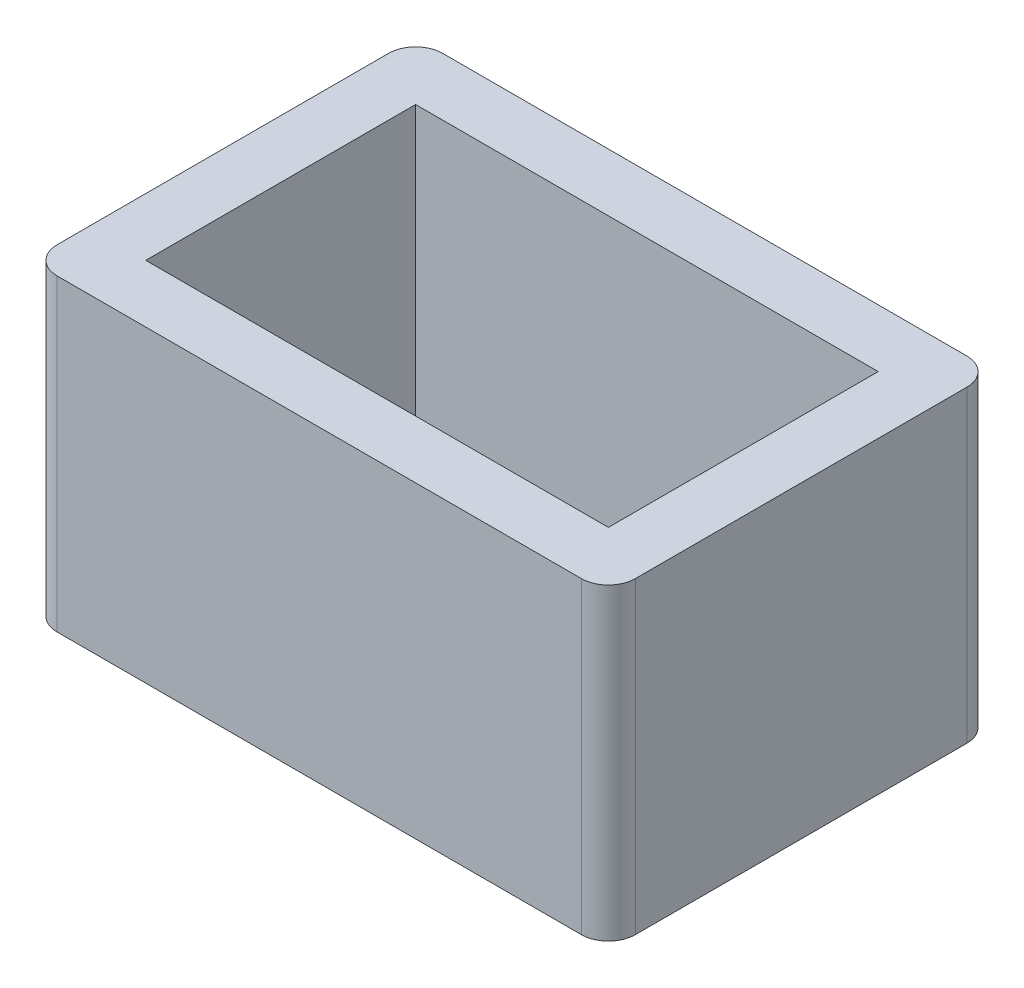
ISO-10303-21;
HEADER;
FILE_DESCRIPTION(('STEP AP214'),'2;1');
FILE_NAME('part.step','',(''),(''),'','','');
FILE_SCHEMA(('AUTOMOTIVE_DESIGN { 1 0 10303 214 1 1 1 1 }'));
ENDSEC;
DATA;
#1=APPLICATION_CONTEXT('core data for automotive mechanical design processes');
#2=APPLICATION_PROTOCOL_DEFINITION('international standard','automotive_design',2000,#1);
#3=PRODUCT_CONTEXT('',#1,'mechanical');
#4=PRODUCT('Part','Part','',(#3));
#5=PRODUCT_RELATED_PRODUCT_CATEGORY('part','',(#4));
#6=PRODUCT_DEFINITION_FORMATION('','',#4);
#7=PRODUCT_DEFINITION_CONTEXT('part definition',#1,'design');
#8=PRODUCT_DEFINITION('design','',#6,#7);
#9=PRODUCT_DEFINITION_SHAPE('','',#8);
#10=(LENGTH_UNIT() NAMED_UNIT(*) SI_UNIT(.MILLI.,.METRE.));
#11=(NAMED_UNIT(*) PLANE_ANGLE_UNIT() SI_UNIT($,.RADIAN.));
#12=(NAMED_UNIT(*) SI_UNIT($,.STERADIAN.) SOLID_ANGLE_UNIT());
#13=UNCERTAINTY_MEASURE_WITH_UNIT(LENGTH_MEASURE(1.E-05),#10,'distance_accuracy_value','');
#14=(GEOMETRIC_REPRESENTATION_CONTEXT(3) GLOBAL_UNCERTAINTY_ASSIGNED_CONTEXT((#13)) GLOBAL_UNIT_ASSIGNED_CONTEXT((#10,
#11,#12)) REPRESENTATION_CONTEXT('',''));
#15=CARTESIAN_POINT('',(0.,0.,0.));
#16=DIRECTION('',(0.,0.,1.));
#17=DIRECTION('',(1.,0.,0.));
#18=AXIS2_PLACEMENT_3D('',#15,#16,#17);
#19=CARTESIAN_POINT('',(-68.,80.,43.));
#20=DIRECTION('',(0.,-1.,0.));
#21=DIRECTION('',(0.,0.,-1.));
#22=AXIS2_PLACEMENT_3D('',#19,#20,#21);
#23=PLANE('',#22);
#24=CARTESIAN_POINT('',(-68.,80.,43.));
#25=DIRECTION('',(0.,1.,0.));
#26=DIRECTION('',(0.,0.,-1.));
#27=AXIS2_PLACEMENT_3D('',#24,#25,#26);
#28=CIRCLE('',#27,7.);
#29=CARTESIAN_POINT('',(-75.,80.,43.));
#30=VERTEX_POINT('',#29);
#31=CARTESIAN_POINT('',(-68.,80.,50.));
#32=VERTEX_POINT('',#31);
#33=EDGE_CURVE('E391',#30,#32,#28,.T.);
#34=ORIENTED_EDGE('',*,*,#33,.T.);
#35=DIRECTION('',(1.,0.,0.));
#36=VECTOR('',#35,1.);
#37=CARTESIAN_POINT('',(-68.,80.,50.));
#38=LINE('',#37,#36);
#39=CARTESIAN_POINT('',(67.9999999999999,80.,50.));
#40=VERTEX_POINT('',#39);
#41=EDGE_CURVE('E395',#32,#40,#38,.T.);
#42=ORIENTED_EDGE('',*,*,#41,.T.);
#43=CARTESIAN_POINT('',(68.,80.,43.));
#44=DIRECTION('',(0.,1.,0.));
#45=DIRECTION('',(0.,0.,1.));
#46=AXIS2_PLACEMENT_3D('',#43,#44,#45);
#47=CIRCLE('',#46,7.);
#48=CARTESIAN_POINT('',(75.,80.,43.));
#49=VERTEX_POINT('',#48);
#50=EDGE_CURVE('E399',#40,#49,#47,.T.);
#51=ORIENTED_EDGE('',*,*,#50,.T.);
#52=DIRECTION('',(0.,0.,-1.));
#53=VECTOR('',#52,1.);
#54=CARTESIAN_POINT('',(75.,80.,43.));
#55=LINE('',#54,#53);
#56=CARTESIAN_POINT('',(75.,80.,-43.));
#57=VERTEX_POINT('',#56);
#58=EDGE_CURVE('E402',#49,#57,#55,.T.);
#59=ORIENTED_EDGE('',*,*,#58,.T.);
#60=CARTESIAN_POINT('',(68.,80.,-43.));
#61=DIRECTION('',(0.,1.,0.));
#62=DIRECTION('',(0.,0.,-1.));
#63=AXIS2_PLACEMENT_3D('',#60,#61,#62);
#64=CIRCLE('',#63,7.);
#65=CARTESIAN_POINT('',(67.9999999999999,80.,-50.));
#66=VERTEX_POINT('',#65);
#67=EDGE_CURVE('E405',#57,#66,#64,.T.);
#68=ORIENTED_EDGE('',*,*,#67,.T.);
#69=DIRECTION('',(-1.,0.,0.));
#70=VECTOR('',#69,1.);
#71=CARTESIAN_POINT('',(-68.,80.,-50.));
#72=LINE('',#71,#70);
#73=CARTESIAN_POINT('',(-68.,80.,-50.));
#74=VERTEX_POINT('',#73);
#75=EDGE_CURVE('E408',#66,#74,#72,.T.);
#76=ORIENTED_EDGE('',*,*,#75,.T.);
#77=CARTESIAN_POINT('',(-68.,80.,-43.));
#78=DIRECTION('',(0.,1.,0.));
#79=DIRECTION('',(0.,0.,-1.));
#80=AXIS2_PLACEMENT_3D('',#77,#78,#79);
#81=CIRCLE('',#80,7.);
#82=CARTESIAN_POINT('',(-75.,80.,-43.));
#83=VERTEX_POINT('',#82);
#84=EDGE_CURVE('E411',#74,#83,#81,.T.);
#85=ORIENTED_EDGE('',*,*,#84,.T.);
#86=DIRECTION('',(0.,0.,1.));
#87=VECTOR('',#86,1.);
#88=CARTESIAN_POINT('',(-75.,80.,43.));
#89=LINE('',#88,#87);
#90=EDGE_CURVE('E414',#83,#30,#89,.T.);
#91=ORIENTED_EDGE('',*,*,#90,.T.);
#92=EDGE_LOOP('',(#34,#42,#51,#59,#68,#76,#85,#91));
#93=FACE_BOUND('',#92,.T.);
#94=DIRECTION('',(0.,0.,1.));
#95=VECTOR('',#94,1.);
#96=CARTESIAN_POINT('',(-60.,80.,35.));
#97=LINE('',#96,#95);
#98=CARTESIAN_POINT('',(-60.,80.,-35.));
#99=VERTEX_POINT('',#98);
#100=CARTESIAN_POINT('',(-60.,80.,35.));
#101=VERTEX_POINT('',#100);
#102=EDGE_CURVE('E349',#99,#101,#97,.T.);
#103=ORIENTED_EDGE('',*,*,#102,.F.);
#104=DIRECTION('',(-1.,0.,0.));
#105=VECTOR('',#104,1.);
#106=CARTESIAN_POINT('',(-60.,80.,-35.));
#107=LINE('',#106,#105);
#108=CARTESIAN_POINT('',(60.,80.,-35.));
#109=VERTEX_POINT('',#108);
#110=EDGE_CURVE('E360',#109,#99,#107,.T.);
#111=ORIENTED_EDGE('',*,*,#110,.F.);
#112=DIRECTION('',(0.,0.,-1.));
#113=VECTOR('',#112,1.);
#114=CARTESIAN_POINT('',(60.,80.,35.));
#115=LINE('',#114,#113);
#116=CARTESIAN_POINT('',(60.,80.,35.));
#117=VERTEX_POINT('',#116);
#118=EDGE_CURVE('E356',#117,#109,#115,.T.);
#119=ORIENTED_EDGE('',*,*,#118,.F.);
#120=DIRECTION('',(1.,0.,0.));
#121=VECTOR('',#120,1.);
#122=CARTESIAN_POINT('',(-60.,80.,35.));
#123=LINE('',#122,#121);
#124=EDGE_CURVE('E352',#101,#117,#123,.T.);
#125=ORIENTED_EDGE('',*,*,#124,.F.);
#126=EDGE_LOOP('',(#103,#111,#119,#125));
#127=FACE_BOUND('',#126,.T.);
#128=ADVANCED_FACE('F39',(#93,#127),#23,.F.);
#129=CARTESIAN_POINT('',(-68.,80.,43.));
#130=DIRECTION('',(0.,-1.,0.));
#131=DIRECTION('',(0.,0.,-1.));
#132=AXIS2_PLACEMENT_3D('',#129,#130,#131);
#133=CYLINDRICAL_SURFACE('',#132,7.);
#134=CARTESIAN_POINT('',(-68.,0.,43.));
#135=DIRECTION('',(0.,1.,0.));
#136=DIRECTION('',(0.,0.,-1.));
#137=AXIS2_PLACEMENT_3D('',#134,#135,#136);
#138=CIRCLE('',#137,7.);
#139=CARTESIAN_POINT('',(-75.,0.,43.));
#140=VERTEX_POINT('',#139);
#141=CARTESIAN_POINT('',(-68.,0.,50.));
#142=VERTEX_POINT('',#141);
#143=EDGE_CURVE('E390',#140,#142,#138,.T.);
#144=ORIENTED_EDGE('',*,*,#143,.T.);
#145=DIRECTION('',(0.,-1.,0.));
#146=VECTOR('',#145,1.);
#147=CARTESIAN_POINT('',(-68.,80.,50.));
#148=LINE('',#147,#146);
#149=EDGE_CURVE('E475',#32,#142,#148,.T.);
#150=ORIENTED_EDGE('',*,*,#149,.F.);
#151=ORIENTED_EDGE('',*,*,#33,.F.);
#152=DIRECTION('',(0.,-1.,0.));
#153=VECTOR('',#152,1.);
#154=CARTESIAN_POINT('',(-75.,80.,43.));
#155=LINE('',#154,#153);
#156=EDGE_CURVE('E417',#30,#140,#155,.T.);
#157=ORIENTED_EDGE('',*,*,#156,.T.);
#158=EDGE_LOOP('',(#144,#150,#151,#157));
#159=FACE_BOUND('',#158,.T.);
#160=ADVANCED_FACE('F41',(#159),#133,.T.);
#161=CARTESIAN_POINT('',(-68.,80.,50.));
#162=DIRECTION('',(0.,0.,-1.));
#163=DIRECTION('',(-1.,0.,0.));
#164=AXIS2_PLACEMENT_3D('',#161,#162,#163);
#165=PLANE('',#164);
#166=DIRECTION('',(1.,0.,0.));
#167=VECTOR('',#166,1.);
#168=CARTESIAN_POINT('',(-68.,0.,50.));
#169=LINE('',#168,#167);
#170=CARTESIAN_POINT('',(67.9999999999999,0.,50.));
#171=VERTEX_POINT('',#170);
#172=EDGE_CURVE('E421',#142,#171,#169,.T.);
#173=ORIENTED_EDGE('',*,*,#172,.T.);
#174=DIRECTION('',(0.,-1.,0.));
#175=VECTOR('',#174,1.);
#176=CARTESIAN_POINT('',(67.9999999999999,80.,50.));
#177=LINE('',#176,#175);
#178=EDGE_CURVE('E471',#40,#171,#177,.T.);
#179=ORIENTED_EDGE('',*,*,#178,.F.);
#180=ORIENTED_EDGE('',*,*,#41,.F.);
#181=ORIENTED_EDGE('',*,*,#149,.T.);
#182=EDGE_LOOP('',(#173,#179,#180,#181));
#183=FACE_BOUND('',#182,.T.);
#184=ADVANCED_FACE('F579',(#183),#165,.F.);
#185=CARTESIAN_POINT('',(68.,80.,43.));
#186=DIRECTION('',(0.,-1.,0.));
#187=DIRECTION('',(0.,0.,-1.));
#188=AXIS2_PLACEMENT_3D('',#185,#186,#187);
#189=CYLINDRICAL_SURFACE('',#188,7.);
#190=CARTESIAN_POINT('',(68.,0.,43.));
#191=DIRECTION('',(0.,1.,0.));
#192=DIRECTION('',(0.,0.,1.));
#193=AXIS2_PLACEMENT_3D('',#190,#191,#192);
#194=CIRCLE('',#193,7.);
#195=CARTESIAN_POINT('',(75.,0.,43.));
#196=VERTEX_POINT('',#195);
#197=EDGE_CURVE('E425',#171,#196,#194,.T.);
#198=ORIENTED_EDGE('',*,*,#197,.T.);
#199=DIRECTION('',(0.,-1.,0.));
#200=VECTOR('',#199,1.);
#201=CARTESIAN_POINT('',(75.,80.,43.));
#202=LINE('',#201,#200);
#203=EDGE_CURVE('E467',#49,#196,#202,.T.);
#204=ORIENTED_EDGE('',*,*,#203,.F.);
#205=ORIENTED_EDGE('',*,*,#50,.F.);
#206=ORIENTED_EDGE('',*,*,#178,.T.);
#207=EDGE_LOOP('',(#198,#204,#205,#206));
#208=FACE_BOUND('',#207,.T.);
#209=ADVANCED_FACE('F572',(#208),#189,.T.);
#210=CARTESIAN_POINT('',(75.,80.,43.));
#211=DIRECTION('',(-1.,0.,0.));
#212=DIRECTION('',(0.,0.,1.));
#213=AXIS2_PLACEMENT_3D('',#210,#211,#212);
#214=PLANE('',#213);
#215=DIRECTION('',(0.,0.,-1.));
#216=VECTOR('',#215,1.);
#217=CARTESIAN_POINT('',(75.,0.,43.));
#218=LINE('',#217,#216);
#219=CARTESIAN_POINT('',(75.,0.,-43.));
#220=VERTEX_POINT('',#219);
#221=EDGE_CURVE('E429',#196,#220,#218,.T.);
#222=ORIENTED_EDGE('',*,*,#221,.T.);
#223=DIRECTION('',(0.,-1.,0.));
#224=VECTOR('',#223,1.);
#225=CARTESIAN_POINT('',(75.,80.,-43.));
#226=LINE('',#225,#224);
#227=EDGE_CURVE('E463',#57,#220,#226,.T.);
#228=ORIENTED_EDGE('',*,*,#227,.F.);
#229=ORIENTED_EDGE('',*,*,#58,.F.);
#230=ORIENTED_EDGE('',*,*,#203,.T.);
#231=EDGE_LOOP('',(#222,#228,#229,#230));
#232=FACE_BOUND('',#231,.T.);
#233=ADVANCED_FACE('F564',(#232),#214,.F.);
#234=CARTESIAN_POINT('',(68.,80.,-43.));
#235=DIRECTION('',(0.,-1.,0.));
#236=DIRECTION('',(0.,0.,-1.));
#237=AXIS2_PLACEMENT_3D('',#234,#235,#236);
#238=CYLINDRICAL_SURFACE('',#237,7.);
#239=CARTESIAN_POINT('',(68.,0.,-43.));
#240=DIRECTION('',(0.,1.,0.));
#241=DIRECTION('',(0.,0.,-1.));
#242=AXIS2_PLACEMENT_3D('',#239,#240,#241);
#243=CIRCLE('',#242,7.);
#244=CARTESIAN_POINT('',(67.9999999999999,0.,-50.));
#245=VERTEX_POINT('',#244);
#246=EDGE_CURVE('E433',#220,#245,#243,.T.);
#247=ORIENTED_EDGE('',*,*,#246,.T.);
#248=DIRECTION('',(0.,-1.,0.));
#249=VECTOR('',#248,1.);
#250=CARTESIAN_POINT('',(67.9999999999999,80.,-50.));
#251=LINE('',#250,#249);
#252=EDGE_CURVE('E459',#66,#245,#251,.T.);
#253=ORIENTED_EDGE('',*,*,#252,.F.);
#254=ORIENTED_EDGE('',*,*,#67,.F.);
#255=ORIENTED_EDGE('',*,*,#227,.T.);
#256=EDGE_LOOP('',(#247,#253,#254,#255));
#257=FACE_BOUND('',#256,.T.);
#258=ADVANCED_FACE('F556',(#257),#238,.T.);
#259=CARTESIAN_POINT('',(-68.,80.,-50.));
#260=DIRECTION('',(0.,0.,1.));
#261=DIRECTION('',(1.,0.,0.));
#262=AXIS2_PLACEMENT_3D('',#259,#260,#261);
#263=PLANE('',#262);
#264=DIRECTION('',(-1.,0.,0.));
#265=VECTOR('',#264,1.);
#266=CARTESIAN_POINT('',(-68.,0.,-50.));
#267=LINE('',#266,#265);
#268=CARTESIAN_POINT('',(-68.,0.,-50.));
#269=VERTEX_POINT('',#268);
#270=EDGE_CURVE('E437',#245,#269,#267,.T.);
#271=ORIENTED_EDGE('',*,*,#270,.T.);
#272=DIRECTION('',(0.,-1.,0.));
#273=VECTOR('',#272,1.);
#274=CARTESIAN_POINT('',(-68.,80.,-50.));
#275=LINE('',#274,#273);
#276=EDGE_CURVE('E455',#74,#269,#275,.T.);
#277=ORIENTED_EDGE('',*,*,#276,.F.);
#278=ORIENTED_EDGE('',*,*,#75,.F.);
#279=ORIENTED_EDGE('',*,*,#252,.T.);
#280=EDGE_LOOP('',(#271,#277,#278,#279));
#281=FACE_BOUND('',#280,.T.);
#282=ADVANCED_FACE('F547',(#281),#263,.F.);
#283=CARTESIAN_POINT('',(-68.,80.,-43.));
#284=DIRECTION('',(0.,-1.,0.));
#285=DIRECTION('',(0.,0.,-1.));
#286=AXIS2_PLACEMENT_3D('',#283,#284,#285);
#287=CYLINDRICAL_SURFACE('',#286,7.);
#288=CARTESIAN_POINT('',(-68.,0.,-43.));
#289=DIRECTION('',(0.,1.,0.));
#290=DIRECTION('',(0.,0.,-1.));
#291=AXIS2_PLACEMENT_3D('',#288,#289,#290);
#292=CIRCLE('',#291,7.);
#293=CARTESIAN_POINT('',(-75.,0.,-43.));
#294=VERTEX_POINT('',#293);
#295=EDGE_CURVE('E441',#269,#294,#292,.T.);
#296=ORIENTED_EDGE('',*,*,#295,.T.);
#297=DIRECTION('',(0.,-1.,0.));
#298=VECTOR('',#297,1.);
#299=CARTESIAN_POINT('',(-75.,80.,-43.));
#300=LINE('',#299,#298);
#301=EDGE_CURVE('E451',#83,#294,#300,.T.);
#302=ORIENTED_EDGE('',*,*,#301,.F.);
#303=ORIENTED_EDGE('',*,*,#84,.F.);
#304=ORIENTED_EDGE('',*,*,#276,.T.);
#305=EDGE_LOOP('',(#296,#302,#303,#304));
#306=FACE_BOUND('',#305,.T.);
#307=ADVANCED_FACE('F539',(#306),#287,.T.);
#308=CARTESIAN_POINT('',(-75.,80.,43.));
#309=DIRECTION('',(1.,0.,0.));
#310=DIRECTION('',(0.,0.,-1.));
#311=AXIS2_PLACEMENT_3D('',#308,#309,#310);
#312=PLANE('',#311);
#313=DIRECTION('',(0.,0.,1.));
#314=VECTOR('',#313,1.);
#315=CARTESIAN_POINT('',(-75.,0.,43.));
#316=LINE('',#315,#314);
#317=EDGE_CURVE('E396',#294,#140,#316,.T.);
#318=ORIENTED_EDGE('',*,*,#317,.T.);
#319=ORIENTED_EDGE('',*,*,#156,.F.);
#320=ORIENTED_EDGE('',*,*,#90,.F.);
#321=ORIENTED_EDGE('',*,*,#301,.T.);
#322=EDGE_LOOP('',(#318,#319,#320,#321));
#323=FACE_BOUND('',#322,.T.);
#324=ADVANCED_FACE('F534',(#323),#312,.F.);
#325=CARTESIAN_POINT('',(-60.,80.,35.));
#326=DIRECTION('',(1.,0.,0.));
#327=DIRECTION('',(0.,0.,-1.));
#328=AXIS2_PLACEMENT_3D('',#325,#326,#327);
#329=PLANE('',#328);
#330=DIRECTION('',(0.,0.,1.));
#331=VECTOR('',#330,1.);
#332=CARTESIAN_POINT('',(-60.,0.,35.));
#333=LINE('',#332,#331);
#334=CARTESIAN_POINT('',(-60.,0.,-35.));
#335=VERTEX_POINT('',#334);
#336=CARTESIAN_POINT('',(-60.,0.,35.));
#337=VERTEX_POINT('',#336);
#338=EDGE_CURVE('E309',#335,#337,#333,.T.);
#339=ORIENTED_EDGE('',*,*,#338,.F.);
#340=DIRECTION('',(0.,-1.,0.));
#341=VECTOR('',#340,1.);
#342=CARTESIAN_POINT('',(-60.,80.,-35.));
#343=LINE('',#342,#341);
#344=EDGE_CURVE('E363',#99,#335,#343,.T.);
#345=ORIENTED_EDGE('',*,*,#344,.F.);
#346=ORIENTED_EDGE('',*,*,#102,.T.);
#347=DIRECTION('',(0.,-1.,0.));
#348=VECTOR('',#347,1.);
#349=CARTESIAN_POINT('',(-60.,80.,35.));
#350=LINE('',#349,#348);
#351=EDGE_CURVE('E386',#101,#337,#350,.T.);
#352=ORIENTED_EDGE('',*,*,#351,.T.);
#353=EDGE_LOOP('',(#339,#345,#346,#352));
#354=FACE_BOUND('',#353,.T.);
#355=ADVANCED_FACE('F592',(#354),#329,.T.);
#356=CARTESIAN_POINT('',(-60.,80.,35.));
#357=DIRECTION('',(0.,0.,-1.));
#358=DIRECTION('',(-1.,0.,0.));
#359=AXIS2_PLACEMENT_3D('',#356,#357,#358);
#360=PLANE('',#359);
#361=DIRECTION('',(1.,0.,0.));
#362=VECTOR('',#361,1.);
#363=CARTESIAN_POINT('',(-60.,0.,35.));
#364=LINE('',#363,#362);
#365=CARTESIAN_POINT('',(60.,0.,35.));
#366=VERTEX_POINT('',#365);
#367=EDGE_CURVE('E367',#337,#366,#364,.T.);
#368=ORIENTED_EDGE('',*,*,#367,.F.);
#369=ORIENTED_EDGE('',*,*,#351,.F.);
#370=ORIENTED_EDGE('',*,*,#124,.T.);
#371=DIRECTION('',(0.,-1.,0.));
#372=VECTOR('',#371,1.);
#373=CARTESIAN_POINT('',(60.,80.,35.));
#374=LINE('',#373,#372);
#375=EDGE_CURVE('E383',#117,#366,#374,.T.);
#376=ORIENTED_EDGE('',*,*,#375,.T.);
#377=EDGE_LOOP('',(#368,#369,#370,#376));
#378=FACE_BOUND('',#377,.T.);
#379=ADVANCED_FACE('F594',(#378),#360,.T.);
#380=CARTESIAN_POINT('',(60.,80.,35.));
#381=DIRECTION('',(-1.,0.,0.));
#382=DIRECTION('',(0.,0.,1.));
#383=AXIS2_PLACEMENT_3D('',#380,#381,#382);
#384=PLANE('',#383);
#385=DIRECTION('',(0.,0.,-1.));
#386=VECTOR('',#385,1.);
#387=CARTESIAN_POINT('',(60.,0.,35.));
#388=LINE('',#387,#386);
#389=CARTESIAN_POINT('',(60.,0.,-35.));
#390=VERTEX_POINT('',#389);
#391=EDGE_CURVE('E371',#366,#390,#388,.T.);
#392=ORIENTED_EDGE('',*,*,#391,.F.);
#393=ORIENTED_EDGE('',*,*,#375,.F.);
#394=ORIENTED_EDGE('',*,*,#118,.T.);
#395=DIRECTION('',(0.,-1.,0.));
#396=VECTOR('',#395,1.);
#397=CARTESIAN_POINT('',(60.,80.,-35.));
#398=LINE('',#397,#396);
#399=EDGE_CURVE('E380',#109,#390,#398,.T.);
#400=ORIENTED_EDGE('',*,*,#399,.T.);
#401=EDGE_LOOP('',(#392,#393,#394,#400));
#402=FACE_BOUND('',#401,.T.);
#403=ADVANCED_FACE('F601',(#402),#384,.T.);
#404=CARTESIAN_POINT('',(-60.,80.,-35.));
#405=DIRECTION('',(0.,0.,1.));
#406=DIRECTION('',(1.,0.,0.));
#407=AXIS2_PLACEMENT_3D('',#404,#405,#406);
#408=PLANE('',#407);
#409=DIRECTION('',(-1.,0.,0.));
#410=VECTOR('',#409,1.);
#411=CARTESIAN_POINT('',(-60.,0.,-35.));
#412=LINE('',#411,#410);
#413=EDGE_CURVE('E353',#390,#335,#412,.T.);
#414=ORIENTED_EDGE('',*,*,#413,.F.);
#415=ORIENTED_EDGE('',*,*,#399,.F.);
#416=ORIENTED_EDGE('',*,*,#110,.T.);
#417=ORIENTED_EDGE('',*,*,#344,.T.);
#418=EDGE_LOOP('',(#414,#415,#416,#417));
#419=FACE_BOUND('',#418,.T.);
#420=ADVANCED_FACE('F599',(#419),#408,.T.);
#421=CARTESIAN_POINT('',(-68.,0.,43.));
#422=DIRECTION('',(0.,-1.,0.));
#423=DIRECTION('',(0.,0.,-1.));
#424=AXIS2_PLACEMENT_3D('',#421,#422,#423);
#425=PLANE('',#424);
#426=DIRECTION('',(1.,0.,0.));
#427=VECTOR('',#426,1.);
#428=CARTESIAN_POINT('',(-52.5,0.,27.5));
#429=LINE('',#428,#427);
#430=CARTESIAN_POINT('',(-52.5,0.,27.5));
#431=VERTEX_POINT('',#430);
#432=CARTESIAN_POINT('',(52.5,0.,27.5));
#433=VERTEX_POINT('',#432);
#434=EDGE_CURVE('E222',#431,#433,#429,.T.);
#435=ORIENTED_EDGE('',*,*,#434,.F.);
#436=DIRECTION('',(0.,0.,1.));
#437=VECTOR('',#436,1.);
#438=CARTESIAN_POINT('',(-52.5,0.,-27.5));
#439=LINE('',#438,#437);
#440=CARTESIAN_POINT('',(-52.5,0.,-27.5));
#441=VERTEX_POINT('',#440);
#442=EDGE_CURVE('E55',#441,#431,#439,.T.);
#443=ORIENTED_EDGE('',*,*,#442,.F.);
#444=DIRECTION('',(-1.,0.,0.));
#445=VECTOR('',#444,1.);
#446=CARTESIAN_POINT('',(52.5,0.,-27.5));
#447=LINE('',#446,#445);
#448=CARTESIAN_POINT('',(52.5,0.,-27.5));
#449=VERTEX_POINT('',#448);
#450=EDGE_CURVE('E230',#449,#441,#447,.T.);
#451=ORIENTED_EDGE('',*,*,#450,.F.);
#452=DIRECTION('',(0.,0.,-1.));
#453=VECTOR('',#452,1.);
#454=CARTESIAN_POINT('',(52.5,0.,27.5));
#455=LINE('',#454,#453);
#456=EDGE_CURVE('E213',#433,#449,#455,.T.);
#457=ORIENTED_EDGE('',*,*,#456,.F.);
#458=EDGE_LOOP('',(#435,#443,#451,#457));
#459=FACE_BOUND('',#458,.T.);
#460=ORIENTED_EDGE('',*,*,#338,.T.);
#461=ORIENTED_EDGE('',*,*,#367,.T.);
#462=ORIENTED_EDGE('',*,*,#391,.T.);
#463=ORIENTED_EDGE('',*,*,#413,.T.);
#464=EDGE_LOOP('',(#460,#461,#462,#463));
#465=FACE_BOUND('',#464,.T.);
#466=ADVANCED_FACE('F227',(#459,#465),#425,.F.);
#467=CARTESIAN_POINT('',(-68.,0.,43.));
#468=DIRECTION('',(0.,1.,0.));
#469=DIRECTION('',(0.,0.,-1.));
#470=AXIS2_PLACEMENT_3D('',#467,#468,#469);
#471=CONICAL_SURFACE('',#470,7.,1.13446401379632);
#472=DIRECTION('',(-0.906307787036651,0.422618261740697,0.));
#473=VECTOR('',#472,1.);
#474=CARTESIAN_POINT('',(-75.,0.,43.));
#475=LINE('',#474,#473);
#476=CARTESIAN_POINT('',(-68.,-3.26415360708499,43.));
#477=VERTEX_POINT('',#476);
#478=EDGE_CURVE('E296',#477,#140,#475,.T.);
#479=ORIENTED_EDGE('',*,*,#478,.F.);
#480=DIRECTION('',(0.,0.422618261740697,0.906307787036651));
#481=VECTOR('',#480,1.);
#482=CARTESIAN_POINT('',(-68.,0.,50.));
#483=LINE('',#482,#481);
#484=EDGE_CURVE('E302',#477,#142,#483,.T.);
#485=ORIENTED_EDGE('',*,*,#484,.T.);
#486=ORIENTED_EDGE('',*,*,#143,.F.);
#487=EDGE_LOOP('',(#479,#485,#486));
#488=FACE_BOUND('',#487,.T.);
#489=ADVANCED_FACE('F527',(#488),#471,.T.);
#490=CARTESIAN_POINT('',(-75.,0.,43.));
#491=DIRECTION('',(-0.422618261740697,-0.906307787036651,0.));
#492=DIRECTION('',(0.906307787036651,-0.422618261740697,0.));
#493=AXIS2_PLACEMENT_3D('',#490,#491,#492);
#494=PLANE('',#493);
#495=ORIENTED_EDGE('',*,*,#317,.F.);
#496=DIRECTION('',(-0.906307787036651,0.422618261740697,0.));
#497=VECTOR('',#496,1.);
#498=CARTESIAN_POINT('',(-75.,0.,-43.));
#499=LINE('',#498,#497);
#500=CARTESIAN_POINT('',(-68.,-3.26415360708499,-43.));
#501=VERTEX_POINT('',#500);
#502=EDGE_CURVE('E301',#501,#294,#499,.T.);
#503=ORIENTED_EDGE('',*,*,#502,.F.);
#504=DIRECTION('',(-0.671542934237819,0.313145613014971,-0.671542934237819));
#505=VECTOR('',#504,1.);
#506=CARTESIAN_POINT('',(-71.8432106123268,-1.47203506665443,-46.8432106123268));
#507=LINE('',#506,#505);
#508=CARTESIAN_POINT('',(-42.8323961923564,-15.,-17.8323961923564));
#509=VERTEX_POINT('',#508);
#510=EDGE_CURVE('E328',#509,#501,#507,.T.);
#511=ORIENTED_EDGE('',*,*,#510,.F.);
#512=DIRECTION('',(0.,0.,1.));
#513=VECTOR('',#512,1.);
#514=CARTESIAN_POINT('',(-42.8323961923564,-15.,43.));
#515=LINE('',#514,#513);
#516=CARTESIAN_POINT('',(-42.8323961923564,-15.,17.8323961923564));
#517=VERTEX_POINT('',#516);
#518=EDGE_CURVE('E287',#517,#509,#515,.F.);
#519=ORIENTED_EDGE('',*,*,#518,.F.);
#520=DIRECTION('',(-0.671542934237819,0.313145613014971,0.671542934237819));
#521=VECTOR('',#520,1.);
#522=CARTESIAN_POINT('',(-71.8432106123268,-1.47203506665443,46.8432106123268));
#523=LINE('',#522,#521);
#524=EDGE_CURVE('E300',#517,#477,#523,.T.);
#525=ORIENTED_EDGE('',*,*,#524,.T.);
#526=ORIENTED_EDGE('',*,*,#478,.T.);
#527=EDGE_LOOP('',(#495,#503,#511,#519,#525,#526));
#528=FACE_BOUND('',#527,.T.);
#529=ADVANCED_FACE('F525',(#528),#494,.T.);
#530=CARTESIAN_POINT('',(-68.,0.,-43.));
#531=DIRECTION('',(0.,1.,0.));
#532=DIRECTION('',(0.,0.,-1.));
#533=AXIS2_PLACEMENT_3D('',#530,#531,#532);
#534=CONICAL_SURFACE('',#533,7.,1.13446401379632);
#535=DIRECTION('',(0.,0.422618261740697,-0.906307787036651));
#536=VECTOR('',#535,1.);
#537=CARTESIAN_POINT('',(-68.,0.,-50.));
#538=LINE('',#537,#536);
#539=EDGE_CURVE('E327',#501,#269,#538,.T.);
#540=ORIENTED_EDGE('',*,*,#539,.F.);
#541=ORIENTED_EDGE('',*,*,#502,.T.);
#542=ORIENTED_EDGE('',*,*,#295,.F.);
#543=EDGE_LOOP('',(#540,#541,#542));
#544=FACE_BOUND('',#543,.T.);
#545=ADVANCED_FACE('F544',(#544),#534,.T.);
#546=CARTESIAN_POINT('',(-68.,0.,-50.));
#547=DIRECTION('',(0.,-0.906307787036651,-0.422618261740697));
#548=DIRECTION('',(0.,0.422618261740697,-0.906307787036651));
#549=AXIS2_PLACEMENT_3D('',#546,#547,#548);
#550=PLANE('',#549);
#551=ORIENTED_EDGE('',*,*,#270,.F.);
#552=DIRECTION('',(0.,0.422618261740697,-0.906307787036651));
#553=VECTOR('',#552,1.);
#554=CARTESIAN_POINT('',(67.9999999999999,0.,-50.));
#555=LINE('',#554,#553);
#556=CARTESIAN_POINT('',(68.,-3.26415360708497,-43.));
#557=VERTEX_POINT('',#556);
#558=EDGE_CURVE('E322',#557,#245,#555,.T.);
#559=ORIENTED_EDGE('',*,*,#558,.F.);
#560=DIRECTION('',(0.671542934237819,0.313145613014971,-0.671542934237819));
#561=VECTOR('',#560,1.);
#562=CARTESIAN_POINT('',(71.8432106123268,-1.47203506665442,-46.8432106123268));
#563=LINE('',#562,#561);
#564=CARTESIAN_POINT('',(42.8323961923564,-15.,-17.8323961923564));
#565=VERTEX_POINT('',#564);
#566=EDGE_CURVE('E319',#565,#557,#563,.T.);
#567=ORIENTED_EDGE('',*,*,#566,.F.);
#568=DIRECTION('',(-1.,0.,0.));
#569=VECTOR('',#568,1.);
#570=CARTESIAN_POINT('',(-68.,-15.,-17.8323961923564));
#571=LINE('',#570,#569);
#572=EDGE_CURVE('E342',#509,#565,#571,.F.);
#573=ORIENTED_EDGE('',*,*,#572,.F.);
#574=ORIENTED_EDGE('',*,*,#510,.T.);
#575=ORIENTED_EDGE('',*,*,#539,.T.);
#576=EDGE_LOOP('',(#551,#559,#567,#573,#574,#575));
#577=FACE_BOUND('',#576,.T.);
#578=ADVANCED_FACE('F552',(#577),#550,.T.);
#579=CARTESIAN_POINT('',(68.,0.,-43.));
#580=DIRECTION('',(0.,1.,0.));
#581=DIRECTION('',(0.,0.,-1.));
#582=AXIS2_PLACEMENT_3D('',#579,#580,#581);
#583=CONICAL_SURFACE('',#582,7.,1.13446401379632);
#584=DIRECTION('',(0.906307787036651,0.422618261740697,0.));
#585=VECTOR('',#584,1.);
#586=CARTESIAN_POINT('',(75.,0.,-43.));
#587=LINE('',#586,#585);
#588=EDGE_CURVE('E318',#557,#220,#587,.T.);
#589=ORIENTED_EDGE('',*,*,#588,.F.);
#590=ORIENTED_EDGE('',*,*,#558,.T.);
#591=ORIENTED_EDGE('',*,*,#246,.F.);
#592=EDGE_LOOP('',(#589,#590,#591));
#593=FACE_BOUND('',#592,.T.);
#594=ADVANCED_FACE('F561',(#593),#583,.T.);
#595=CARTESIAN_POINT('',(75.,0.,-43.));
#596=DIRECTION('',(0.422618261740697,-0.906307787036651,0.));
#597=DIRECTION('',(0.906307787036651,0.422618261740697,0.));
#598=AXIS2_PLACEMENT_3D('',#595,#596,#597);
#599=PLANE('',#598);
#600=ORIENTED_EDGE('',*,*,#221,.F.);
#601=DIRECTION('',(0.906307787036651,0.422618261740697,0.));
#602=VECTOR('',#601,1.);
#603=CARTESIAN_POINT('',(75.,0.,43.));
#604=LINE('',#603,#602);
#605=CARTESIAN_POINT('',(67.9999999999999,-3.26415360708499,43.));
#606=VERTEX_POINT('',#605);
#607=EDGE_CURVE('E313',#606,#196,#604,.T.);
#608=ORIENTED_EDGE('',*,*,#607,.F.);
#609=DIRECTION('',(0.671542934237819,0.313145613014971,0.671542934237819));
#610=VECTOR('',#609,1.);
#611=CARTESIAN_POINT('',(71.8432106123268,-1.47203506665443,46.8432106123268));
#612=LINE('',#611,#610);
#613=CARTESIAN_POINT('',(42.8323961923564,-15.,17.8323961923564));
#614=VERTEX_POINT('',#613);
#615=EDGE_CURVE('E310',#614,#606,#612,.T.);
#616=ORIENTED_EDGE('',*,*,#615,.F.);
#617=DIRECTION('',(0.,0.,-1.));
#618=VECTOR('',#617,1.);
#619=CARTESIAN_POINT('',(42.8323961923564,-15.,-43.));
#620=LINE('',#619,#618);
#621=EDGE_CURVE('E338',#565,#614,#620,.F.);
#622=ORIENTED_EDGE('',*,*,#621,.F.);
#623=ORIENTED_EDGE('',*,*,#566,.T.);
#624=ORIENTED_EDGE('',*,*,#588,.T.);
#625=EDGE_LOOP('',(#600,#608,#616,#622,#623,#624));
#626=FACE_BOUND('',#625,.T.);
#627=ADVANCED_FACE('F569',(#626),#599,.T.);
#628=CARTESIAN_POINT('',(68.,0.,43.));
#629=DIRECTION('',(0.,1.,0.));
#630=DIRECTION('',(0.,0.,-1.));
#631=AXIS2_PLACEMENT_3D('',#628,#629,#630);
#632=CONICAL_SURFACE('',#631,7.,1.13446401379632);
#633=DIRECTION('',(0.,0.422618261740697,0.906307787036651));
#634=VECTOR('',#633,1.);
#635=CARTESIAN_POINT('',(67.9999999999999,0.,50.));
#636=LINE('',#635,#634);
#637=EDGE_CURVE('E305',#606,#171,#636,.T.);
#638=ORIENTED_EDGE('',*,*,#637,.F.);
#639=ORIENTED_EDGE('',*,*,#607,.T.);
#640=ORIENTED_EDGE('',*,*,#197,.F.);
#641=EDGE_LOOP('',(#638,#639,#640));
#642=FACE_BOUND('',#641,.T.);
#643=ADVANCED_FACE('F577',(#642),#632,.T.);
#644=CARTESIAN_POINT('',(67.9999999999999,0.,50.));
#645=DIRECTION('',(0.,-0.906307787036651,0.422618261740697));
#646=DIRECTION('',(0.,-0.422618261740697,-0.906307787036651));
#647=AXIS2_PLACEMENT_3D('',#644,#645,#646);
#648=PLANE('',#647);
#649=ORIENTED_EDGE('',*,*,#172,.F.);
#650=ORIENTED_EDGE('',*,*,#484,.F.);
#651=ORIENTED_EDGE('',*,*,#524,.F.);
#652=DIRECTION('',(1.,0.,0.));
#653=VECTOR('',#652,1.);
#654=CARTESIAN_POINT('',(67.9999999999999,-15.,17.8323961923564));
#655=LINE('',#654,#653);
#656=EDGE_CURVE('E306',#614,#517,#655,.F.);
#657=ORIENTED_EDGE('',*,*,#656,.F.);
#658=ORIENTED_EDGE('',*,*,#615,.T.);
#659=ORIENTED_EDGE('',*,*,#637,.T.);
#660=EDGE_LOOP('',(#649,#650,#651,#657,#658,#659));
#661=FACE_BOUND('',#660,.T.);
#662=ADVANCED_FACE('F514',(#661),#648,.T.);
#663=CARTESIAN_POINT('',(-68.,-15.,43.));
#664=DIRECTION('',(0.,-1.,0.));
#665=DIRECTION('',(0.,0.,-1.));
#666=AXIS2_PLACEMENT_3D('',#663,#664,#665);
#667=PLANE('',#666);
#668=DIRECTION('',(0.,0.,1.));
#669=VECTOR('',#668,1.);
#670=CARTESIAN_POINT('',(-7.83239619235641,-15.,12.8323961923564));
#671=LINE('',#670,#669);
#672=CARTESIAN_POINT('',(-7.83239619235641,-15.,-12.1676038076436));
#673=VERTEX_POINT('',#672);
#674=CARTESIAN_POINT('',(-7.83239619235641,-15.,12.8323961923564));
#675=VERTEX_POINT('',#674);
#676=EDGE_CURVE('E267',#673,#675,#671,.T.);
#677=ORIENTED_EDGE('',*,*,#676,.F.);
#678=DIRECTION('',(1.,0.,0.));
#679=VECTOR('',#678,1.);
#680=CARTESIAN_POINT('',(-32.8323961923564,-15.,-12.1676038076436));
#681=LINE('',#680,#679);
#682=CARTESIAN_POINT('',(-32.8323961923564,-15.,-12.1676038076436));
#683=VERTEX_POINT('',#682);
#684=EDGE_CURVE('E279',#683,#673,#681,.T.);
#685=ORIENTED_EDGE('',*,*,#684,.F.);
#686=DIRECTION('',(0.,0.,-1.));
#687=VECTOR('',#686,1.);
#688=CARTESIAN_POINT('',(-32.8323961923564,-15.,12.8323961923564));
#689=LINE('',#688,#687);
#690=CARTESIAN_POINT('',(-32.8323961923564,-15.,12.8323961923564));
#691=VERTEX_POINT('',#690);
#692=EDGE_CURVE('E275',#691,#683,#689,.T.);
#693=ORIENTED_EDGE('',*,*,#692,.F.);
#694=DIRECTION('',(-1.,0.,0.));
#695=VECTOR('',#694,1.);
#696=CARTESIAN_POINT('',(-32.8323961923564,-15.,12.8323961923564));
#697=LINE('',#696,#695);
#698=EDGE_CURVE('E271',#675,#691,#697,.T.);
#699=ORIENTED_EDGE('',*,*,#698,.F.);
#700=EDGE_LOOP('',(#677,#685,#693,#699));
#701=FACE_BOUND('',#700,.T.);
#702=ORIENTED_EDGE('',*,*,#656,.T.);
#703=ORIENTED_EDGE('',*,*,#518,.T.);
#704=ORIENTED_EDGE('',*,*,#572,.T.);
#705=ORIENTED_EDGE('',*,*,#621,.T.);
#706=EDGE_LOOP('',(#702,#703,#704,#705));
#707=FACE_BOUND('',#706,.T.);
#708=ADVANCED_FACE('F511',(#701,#707),#667,.T.);
#709=CARTESIAN_POINT('',(-7.83239619235641,35.3553390593274,12.8323961923564));
#710=DIRECTION('',(1.,0.,0.));
#711=DIRECTION('',(0.,0.,-1.));
#712=AXIS2_PLACEMENT_3D('',#709,#710,#711);
#713=PLANE('',#712);
#714=DIRECTION('',(0.,0.,1.));
#715=VECTOR('',#714,1.);
#716=CARTESIAN_POINT('',(-7.83239619235641,-10.,12.8323961923564));
#717=LINE('',#716,#715);
#718=CARTESIAN_POINT('',(-7.83239619235641,-10.,-6.05493079490428));
#719=VERTEX_POINT('',#718);
#720=CARTESIAN_POINT('',(-7.83239619235641,-10.,6.05493079490427));
#721=VERTEX_POINT('',#720);
#722=EDGE_CURVE('E11',#719,#721,#717,.T.);
#723=ORIENTED_EDGE('',*,*,#722,.F.);
#724=DIRECTION('',(0.,0.422618261740697,-0.906307787036651));
#725=VECTOR('',#724,1.);
#726=CARTESIAN_POINT('',(-7.83239619235641,-9.13352140255124,-7.91310014360658));
#727=LINE('',#726,#725);
#728=CARTESIAN_POINT('',(-7.83239619235641,-7.1496137623623,-12.1676038076436));
#729=VERTEX_POINT('',#728);
#730=EDGE_CURVE('E263',#719,#729,#727,.T.);
#731=ORIENTED_EDGE('',*,*,#730,.T.);
#732=DIRECTION('',(0.,-1.,0.));
#733=VECTOR('',#732,1.);
#734=CARTESIAN_POINT('',(-7.83239619235641,35.3553390593274,-12.1676038076436));
#735=LINE('',#734,#733);
#736=EDGE_CURVE('E284',#729,#673,#735,.T.);
#737=ORIENTED_EDGE('',*,*,#736,.T.);
#738=ORIENTED_EDGE('',*,*,#676,.T.);
#739=DIRECTION('',(0.,-1.,0.));
#740=VECTOR('',#739,1.);
#741=CARTESIAN_POINT('',(-7.83239619235641,35.3553390593274,12.8323961923564));
#742=LINE('',#741,#740);
#743=CARTESIAN_POINT('',(-7.83239619235641,-6.83961598228758,12.8323961923564));
#744=VERTEX_POINT('',#743);
#745=EDGE_CURVE('E283',#744,#675,#742,.T.);
#746=ORIENTED_EDGE('',*,*,#745,.F.);
#747=DIRECTION('',(0.,-0.422618261740697,-0.906307787036651));
#748=VECTOR('',#747,1.);
#749=CARTESIAN_POINT('',(-7.8323961923564,0.696664392504487,28.9940016109985));
#750=LINE('',#749,#748);
#751=EDGE_CURVE('E63',#744,#721,#750,.T.);
#752=ORIENTED_EDGE('',*,*,#751,.T.);
#753=EDGE_LOOP('',(#723,#731,#737,#738,#746,#752));
#754=FACE_BOUND('',#753,.T.);
#755=ADVANCED_FACE('F501',(#754),#713,.F.);
#756=CARTESIAN_POINT('',(-32.8323961923564,35.3553390593274,-12.1676038076436));
#757=DIRECTION('',(0.,0.,-1.));
#758=DIRECTION('',(-1.,0.,0.));
#759=AXIS2_PLACEMENT_3D('',#756,#757,#758);
#760=PLANE('',#759);
#761=ORIENTED_EDGE('',*,*,#736,.F.);
#762=DIRECTION('',(-1.,0.,0.));
#763=VECTOR('',#762,1.);
#764=CARTESIAN_POINT('',(-32.8323961923564,-7.1496137623623,-12.1676038076436));
#765=LINE('',#764,#763);
#766=CARTESIAN_POINT('',(-32.8323961923564,-7.1496137623623,-12.1676038076436));
#767=VERTEX_POINT('',#766);
#768=EDGE_CURVE('E259',#729,#767,#765,.T.);
#769=ORIENTED_EDGE('',*,*,#768,.T.);
#770=DIRECTION('',(0.,-1.,0.));
#771=VECTOR('',#770,1.);
#772=CARTESIAN_POINT('',(-32.8323961923564,35.3553390593274,-12.1676038076436));
#773=LINE('',#772,#771);
#774=EDGE_CURVE('E288',#767,#683,#773,.T.);
#775=ORIENTED_EDGE('',*,*,#774,.T.);
#776=ORIENTED_EDGE('',*,*,#684,.T.);
#777=EDGE_LOOP('',(#761,#769,#775,#776));
#778=FACE_BOUND('',#777,.T.);
#779=ADVANCED_FACE('F496',(#778),#760,.F.);
#780=CARTESIAN_POINT('',(-32.8323961923564,35.3553390593274,12.8323961923564));
#781=DIRECTION('',(-1.,0.,0.));
#782=DIRECTION('',(0.,0.,1.));
#783=AXIS2_PLACEMENT_3D('',#780,#781,#782);
#784=PLANE('',#783);
#785=ORIENTED_EDGE('',*,*,#774,.F.);
#786=DIRECTION('',(0.,-0.422618261740697,0.906307787036651));
#787=VECTOR('',#786,1.);
#788=CARTESIAN_POINT('',(-32.8323961923564,-9.13352140255124,-7.91310014360658));
#789=LINE('',#788,#787);
#790=CARTESIAN_POINT('',(-32.8323961923564,-9.17115427306257,-7.8323961923564));
#791=VERTEX_POINT('',#790);
#792=EDGE_CURVE('E48',#767,#791,#789,.T.);
#793=ORIENTED_EDGE('',*,*,#792,.T.);
#794=DIRECTION('',(0.,0.,1.));
#795=VECTOR('',#794,1.);
#796=CARTESIAN_POINT('',(-32.8323961923564,-9.17115427306255,12.8323961923564));
#797=LINE('',#796,#795);
#798=CARTESIAN_POINT('',(-32.8323961923564,-9.17115427306256,7.83239619235641));
#799=VERTEX_POINT('',#798);
#800=EDGE_CURVE('E482',#791,#799,#797,.T.);
#801=ORIENTED_EDGE('',*,*,#800,.T.);
#802=DIRECTION('',(0.,0.422618261740697,0.906307787036651));
#803=VECTOR('',#802,1.);
#804=CARTESIAN_POINT('',(-32.8323961923564,0.696664392504487,28.9940016109985));
#805=LINE('',#804,#803);
#806=CARTESIAN_POINT('',(-32.8323961923564,-6.83961598228758,12.8323961923564));
#807=VERTEX_POINT('',#806);
#808=EDGE_CURVE('E241',#799,#807,#805,.T.);
#809=ORIENTED_EDGE('',*,*,#808,.T.);
#810=DIRECTION('',(0.,-1.,0.));
#811=VECTOR('',#810,1.);
#812=CARTESIAN_POINT('',(-32.8323961923564,35.3553390593274,12.8323961923564));
#813=LINE('',#812,#811);
#814=EDGE_CURVE('E291',#807,#691,#813,.T.);
#815=ORIENTED_EDGE('',*,*,#814,.T.);
#816=ORIENTED_EDGE('',*,*,#692,.T.);
#817=EDGE_LOOP('',(#785,#793,#801,#809,#815,#816));
#818=FACE_BOUND('',#817,.T.);
#819=ADVANCED_FACE('F489',(#818),#784,.F.);
#820=CARTESIAN_POINT('',(-32.8323961923564,35.3553390593274,12.8323961923564));
#821=DIRECTION('',(0.,0.,1.));
#822=DIRECTION('',(1.,0.,0.));
#823=AXIS2_PLACEMENT_3D('',#820,#821,#822);
#824=PLANE('',#823);
#825=ORIENTED_EDGE('',*,*,#814,.F.);
#826=DIRECTION('',(1.,0.,0.));
#827=VECTOR('',#826,1.);
#828=CARTESIAN_POINT('',(-32.8323961923564,-6.83961598228758,12.8323961923564));
#829=LINE('',#828,#827);
#830=EDGE_CURVE('E479',#807,#744,#829,.T.);
#831=ORIENTED_EDGE('',*,*,#830,.T.);
#832=ORIENTED_EDGE('',*,*,#745,.T.);
#833=ORIENTED_EDGE('',*,*,#698,.T.);
#834=EDGE_LOOP('',(#825,#831,#832,#833));
#835=FACE_BOUND('',#834,.T.);
#836=ADVANCED_FACE('F508',(#835),#824,.F.);
#837=CARTESIAN_POINT('',(0.,-10.,0.));
#838=DIRECTION('',(0.,1.,0.));
#839=DIRECTION('',(0.,0.,1.));
#840=AXIS2_PLACEMENT_3D('',#837,#838,#839);
#841=PLANE('',#840);
#842=ORIENTED_EDGE('',*,*,#722,.T.);
#843=DIRECTION('',(1.,0.,0.));
#844=VECTOR('',#843,1.);
#845=CARTESIAN_POINT('',(0.,-10.,6.05493079490427));
#846=LINE('',#845,#844);
#847=CARTESIAN_POINT('',(31.0549307949043,-10.,6.05493079490427));
#848=VERTEX_POINT('',#847);
#849=EDGE_CURVE('E234',#721,#848,#846,.T.);
#850=ORIENTED_EDGE('',*,*,#849,.T.);
#851=DIRECTION('',(0.,0.,-1.));
#852=VECTOR('',#851,1.);
#853=CARTESIAN_POINT('',(31.0549307949043,-10.,0.));
#854=LINE('',#853,#852);
#855=CARTESIAN_POINT('',(31.0549307949043,-10.,-6.05493079490428));
#856=VERTEX_POINT('',#855);
#857=EDGE_CURVE('E216',#848,#856,#854,.T.);
#858=ORIENTED_EDGE('',*,*,#857,.T.);
#859=DIRECTION('',(-1.,0.,0.));
#860=VECTOR('',#859,1.);
#861=CARTESIAN_POINT('',(0.,-10.,-6.05493079490428));
#862=LINE('',#861,#860);
#863=EDGE_CURVE('E243',#856,#719,#862,.T.);
#864=ORIENTED_EDGE('',*,*,#863,.T.);
#865=EDGE_LOOP('',(#842,#850,#858,#864));
#866=FACE_BOUND('',#865,.T.);
#867=ADVANCED_FACE('F505',(#866),#841,.T.);
#868=CARTESIAN_POINT('',(-52.5,0.,-27.5));
#869=DIRECTION('',(-0.422618261740697,-0.906307787036651,0.));
#870=DIRECTION('',(0.906307787036651,-0.422618261740697,0.));
#871=AXIS2_PLACEMENT_3D('',#868,#869,#870);
#872=PLANE('',#871);
#873=DIRECTION('',(-0.671542934237819,0.313145613014971,-0.671542934237819));
#874=VECTOR('',#873,1.);
#875=CARTESIAN_POINT('',(-5.14815918490243,-22.0805259998163,19.8518408150976));
#876=LINE('',#875,#874);
#877=EDGE_CURVE('E238',#791,#441,#876,.T.);
#878=ORIENTED_EDGE('',*,*,#877,.T.);
#879=ORIENTED_EDGE('',*,*,#442,.T.);
#880=DIRECTION('',(-0.671542934237819,0.313145613014971,0.671542934237819));
#881=VECTOR('',#880,1.);
#882=CARTESIAN_POINT('',(-27.6966548111394,-11.5659898094276,2.69665481113936));
#883=LINE('',#882,#881);
#884=EDGE_CURVE('E219',#799,#431,#883,.T.);
#885=ORIENTED_EDGE('',*,*,#884,.F.);
#886=ORIENTED_EDGE('',*,*,#800,.F.);
#887=EDGE_LOOP('',(#878,#879,#885,#886));
#888=FACE_BOUND('',#887,.T.);
#889=ADVANCED_FACE('F795',(#888),#872,.F.);
#890=CARTESIAN_POINT('',(52.5,0.,-27.5));
#891=DIRECTION('',(0.,-0.906307787036651,-0.422618261740697));
#892=DIRECTION('',(0.,0.422618261740697,-0.906307787036651));
#893=AXIS2_PLACEMENT_3D('',#890,#891,#892);
#894=PLANE('',#893);
#895=ORIENTED_EDGE('',*,*,#863,.F.);
#896=DIRECTION('',(0.671542934237818,0.313145613014971,-0.671542934237819));
#897=VECTOR('',#896,1.);
#898=CARTESIAN_POINT('',(27.6966548111393,-11.5659898094276,-2.69665481113937));
#899=LINE('',#898,#897);
#900=EDGE_CURVE('E218',#856,#449,#899,.T.);
#901=ORIENTED_EDGE('',*,*,#900,.T.);
#902=ORIENTED_EDGE('',*,*,#450,.T.);
#903=ORIENTED_EDGE('',*,*,#877,.F.);
#904=ORIENTED_EDGE('',*,*,#792,.F.);
#905=ORIENTED_EDGE('',*,*,#768,.F.);
#906=ORIENTED_EDGE('',*,*,#730,.F.);
#907=EDGE_LOOP('',(#895,#901,#902,#903,#904,#905,#906));
#908=FACE_BOUND('',#907,.T.);
#909=ADVANCED_FACE('F493',(#908),#894,.F.);
#910=CARTESIAN_POINT('',(-52.5,0.,27.5));
#911=DIRECTION('',(0.,-0.906307787036651,0.422618261740697));
#912=DIRECTION('',(0.,-0.422618261740697,-0.906307787036651));
#913=AXIS2_PLACEMENT_3D('',#910,#911,#912);
#914=PLANE('',#913);
#915=ORIENTED_EDGE('',*,*,#830,.F.);
#916=ORIENTED_EDGE('',*,*,#808,.F.);
#917=ORIENTED_EDGE('',*,*,#884,.T.);
#918=ORIENTED_EDGE('',*,*,#434,.T.);
#919=DIRECTION('',(0.671542934237819,0.313145613014971,0.671542934237819));
#920=VECTOR('',#919,1.);
#921=CARTESIAN_POINT('',(5.1481591849024,-22.0805259998163,-19.8518408150976));
#922=LINE('',#921,#920);
#923=EDGE_CURVE('E209',#848,#433,#922,.T.);
#924=ORIENTED_EDGE('',*,*,#923,.F.);
#925=ORIENTED_EDGE('',*,*,#849,.F.);
#926=ORIENTED_EDGE('',*,*,#751,.F.);
#927=EDGE_LOOP('',(#915,#916,#917,#918,#924,#925,#926));
#928=FACE_BOUND('',#927,.T.);
#929=ADVANCED_FACE('F223',(#928),#914,.F.);
#930=CARTESIAN_POINT('',(52.5,0.,27.5));
#931=DIRECTION('',(0.422618261740697,-0.906307787036651,0.));
#932=DIRECTION('',(0.906307787036651,0.422618261740697,0.));
#933=AXIS2_PLACEMENT_3D('',#930,#931,#932);
#934=PLANE('',#933);
#935=ORIENTED_EDGE('',*,*,#456,.T.);
#936=ORIENTED_EDGE('',*,*,#900,.F.);
#937=ORIENTED_EDGE('',*,*,#857,.F.);
#938=ORIENTED_EDGE('',*,*,#923,.T.);
#939=EDGE_LOOP('',(#935,#936,#937,#938));
#940=FACE_BOUND('',#939,.T.);
#941=ADVANCED_FACE('F211',(#940),#934,.F.);
#942=CLOSED_SHELL('',(#128,#160,#184,#209,#233,#258,#282,#307,#324,#355,#379,#403,#420,#466,
#489,#529,#545,#578,#594,#627,#643,#662,#708,#755,#779,#819,#836,#867,#889,#909,#929,#941));
#943=MANIFOLD_SOLID_BREP('B2',#942);
#944=ADVANCED_BREP_SHAPE_REPRESENTATION('',(#18,#943),#14);
#945=SHAPE_DEFINITION_REPRESENTATION(#9,#944);
ENDSEC;
END-ISO-10303-21;
